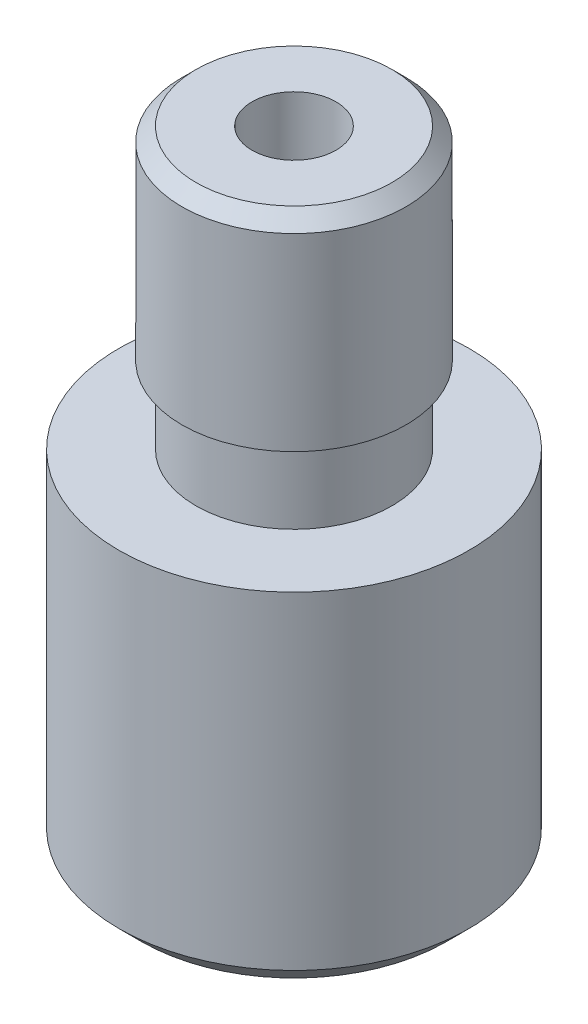
ISO-10303-21;
HEADER;
FILE_DESCRIPTION(('STEP AP214'),'2;1');
FILE_NAME('part.step','',(''),(''),'','','');
FILE_SCHEMA(('AUTOMOTIVE_DESIGN { 1 0 10303 214 1 1 1 1 }'));
ENDSEC;
DATA;
#1=APPLICATION_CONTEXT('core data for automotive mechanical design processes');
#2=APPLICATION_PROTOCOL_DEFINITION('international standard','automotive_design',2000,#1);
#3=PRODUCT_CONTEXT('',#1,'mechanical');
#4=PRODUCT('Part','Part','',(#3));
#5=PRODUCT_RELATED_PRODUCT_CATEGORY('part','',(#4));
#6=PRODUCT_DEFINITION_FORMATION('','',#4);
#7=PRODUCT_DEFINITION_CONTEXT('part definition',#1,'design');
#8=PRODUCT_DEFINITION('design','',#6,#7);
#9=PRODUCT_DEFINITION_SHAPE('','',#8);
#10=(LENGTH_UNIT() NAMED_UNIT(*) SI_UNIT(.MILLI.,.METRE.));
#11=(NAMED_UNIT(*) PLANE_ANGLE_UNIT() SI_UNIT($,.RADIAN.));
#12=(NAMED_UNIT(*) SI_UNIT($,.STERADIAN.) SOLID_ANGLE_UNIT());
#13=UNCERTAINTY_MEASURE_WITH_UNIT(LENGTH_MEASURE(1.E-05),#10,'distance_accuracy_value','');
#14=(GEOMETRIC_REPRESENTATION_CONTEXT(3) GLOBAL_UNCERTAINTY_ASSIGNED_CONTEXT((#13)) GLOBAL_UNIT_ASSIGNED_CONTEXT((#10,
#11,#12)) REPRESENTATION_CONTEXT('',''));
#15=CARTESIAN_POINT('',(0.,0.,0.));
#16=DIRECTION('',(0.,0.,1.));
#17=DIRECTION('',(1.,0.,0.));
#18=AXIS2_PLACEMENT_3D('',#15,#16,#17);
#19=CARTESIAN_POINT('',(0.,36.6101694915254,0.));
#20=DIRECTION('',(0.,1.,0.));
#21=DIRECTION('',(0.,0.,1.));
#22=AXIS2_PLACEMENT_3D('',#19,#20,#21);
#23=CYLINDRICAL_SURFACE('',#22,12.5);
#24=CARTESIAN_POINT('',(0.,-28.9084745762712,0.));
#25=DIRECTION('',(0.,1.,0.));
#26=DIRECTION('',(0.,0.,1.));
#27=AXIS2_PLACEMENT_3D('',#24,#25,#26);
#28=CIRCLE('',#27,12.5);
#29=CARTESIAN_POINT('',(0.,-28.9084745762712,12.5));
#30=VERTEX_POINT('',#29);
#31=EDGE_CURVE('E51',#30,#30,#28,.T.);
#32=ORIENTED_EDGE('',*,*,#31,.T.);
#33=EDGE_LOOP('',(#32));
#34=FACE_BOUND('',#33,.T.);
#35=CARTESIAN_POINT('',(0.,-5.50847457627119,0.));
#36=DIRECTION('',(0.,1.,0.));
#37=DIRECTION('',(0.,0.,1.));
#38=AXIS2_PLACEMENT_3D('',#35,#36,#37);
#39=CIRCLE('',#38,12.5);
#40=CARTESIAN_POINT('',(0.,-5.50847457627119,12.5));
#41=VERTEX_POINT('',#40);
#42=EDGE_CURVE('E56',#41,#41,#39,.T.);
#43=ORIENTED_EDGE('',*,*,#42,.F.);
#44=EDGE_LOOP('',(#43));
#45=FACE_BOUND('',#44,.T.);
#46=ADVANCED_FACE('F35',(#34,#45),#23,.T.);
#47=CARTESIAN_POINT('',(12.5,-5.50847457627119,0.));
#48=DIRECTION('',(0.,-1.,0.));
#49=DIRECTION('',(0.,0.,-1.));
#50=AXIS2_PLACEMENT_3D('',#47,#48,#49);
#51=PLANE('',#50);
#52=CARTESIAN_POINT('',(0.,-5.50847457627119,0.));
#53=DIRECTION('',(0.,1.,0.));
#54=DIRECTION('',(0.,0.,1.));
#55=AXIS2_PLACEMENT_3D('',#52,#53,#54);
#56=CIRCLE('',#55,7.);
#57=CARTESIAN_POINT('',(0.,-5.50847457627119,7.));
#58=VERTEX_POINT('',#57);
#59=EDGE_CURVE('E59',#58,#58,#56,.T.);
#60=ORIENTED_EDGE('',*,*,#59,.F.);
#61=EDGE_LOOP('',(#60));
#62=FACE_BOUND('',#61,.T.);
#63=ORIENTED_EDGE('',*,*,#42,.T.);
#64=EDGE_LOOP('',(#63));
#65=FACE_BOUND('',#64,.T.);
#66=ADVANCED_FACE('F93',(#62,#65),#51,.F.);
#67=CARTESIAN_POINT('',(0.,36.6101694915254,0.));
#68=DIRECTION('',(0.,1.,0.));
#69=DIRECTION('',(0.,0.,1.));
#70=AXIS2_PLACEMENT_3D('',#67,#68,#69);
#71=CYLINDRICAL_SURFACE('',#70,7.);
#72=CARTESIAN_POINT('',(0.,0.,0.));
#73=DIRECTION('',(0.,1.,0.));
#74=DIRECTION('',(0.,0.,1.));
#75=AXIS2_PLACEMENT_3D('',#72,#73,#74);
#76=CIRCLE('',#75,7.00000000000001);
#77=CARTESIAN_POINT('',(0.,0.,7.00000000000001));
#78=VERTEX_POINT('',#77);
#79=EDGE_CURVE('E62',#78,#78,#76,.T.);
#80=ORIENTED_EDGE('',*,*,#79,.F.);
#81=EDGE_LOOP('',(#80));
#82=FACE_BOUND('',#81,.T.);
#83=ORIENTED_EDGE('',*,*,#59,.T.);
#84=EDGE_LOOP('',(#83));
#85=FACE_BOUND('',#84,.T.);
#86=ADVANCED_FACE('F99',(#82,#85),#71,.T.);
#87=CARTESIAN_POINT('',(7.00000000000001,0.,0.));
#88=DIRECTION('',(0.,1.,0.));
#89=DIRECTION('',(0.,0.,1.));
#90=AXIS2_PLACEMENT_3D('',#87,#88,#89);
#91=PLANE('',#90);
#92=CARTESIAN_POINT('',(0.,0.,0.));
#93=DIRECTION('',(0.,1.,0.));
#94=DIRECTION('',(0.,0.,1.));
#95=AXIS2_PLACEMENT_3D('',#92,#93,#94);
#96=CIRCLE('',#95,8.);
#97=CARTESIAN_POINT('',(0.,0.,8.));
#98=VERTEX_POINT('',#97);
#99=EDGE_CURVE('E65',#98,#98,#96,.T.);
#100=ORIENTED_EDGE('',*,*,#99,.F.);
#101=EDGE_LOOP('',(#100));
#102=FACE_BOUND('',#101,.T.);
#103=ORIENTED_EDGE('',*,*,#79,.T.);
#104=EDGE_LOOP('',(#103));
#105=FACE_BOUND('',#104,.T.);
#106=ADVANCED_FACE('F90',(#102,#105),#91,.F.);
#107=CARTESIAN_POINT('',(0.,36.6101694915254,0.));
#108=DIRECTION('',(0.,1.,0.));
#109=DIRECTION('',(0.,0.,1.));
#110=AXIS2_PLACEMENT_3D('',#107,#108,#109);
#111=CYLINDRICAL_SURFACE('',#110,8.);
#112=CARTESIAN_POINT('',(0.,13.4915254237288,0.));
#113=DIRECTION('',(0.,-1.,0.));
#114=DIRECTION('',(0.,0.,-1.));
#115=AXIS2_PLACEMENT_3D('',#112,#113,#114);
#116=CIRCLE('',#115,8.);
#117=CARTESIAN_POINT('',(0.,13.4915254237288,-8.));
#118=VERTEX_POINT('',#117);
#119=EDGE_CURVE('E10',#118,#118,#116,.T.);
#120=ORIENTED_EDGE('',*,*,#119,.T.);
#121=EDGE_LOOP('',(#120));
#122=FACE_BOUND('',#121,.T.);
#123=ORIENTED_EDGE('',*,*,#99,.T.);
#124=EDGE_LOOP('',(#123));
#125=FACE_BOUND('',#124,.T.);
#126=ADVANCED_FACE('F85',(#122,#125),#111,.T.);
#127=CARTESIAN_POINT('',(8.,14.4915254237288,0.));
#128=DIRECTION('',(0.,-1.,0.));
#129=DIRECTION('',(0.,0.,-1.));
#130=AXIS2_PLACEMENT_3D('',#127,#128,#129);
#131=PLANE('',#130);
#132=CARTESIAN_POINT('',(0.,14.4915254237288,0.));
#133=DIRECTION('',(0.,-1.,0.));
#134=DIRECTION('',(0.,0.,-1.));
#135=AXIS2_PLACEMENT_3D('',#132,#133,#134);
#136=CIRCLE('',#135,7.00000000000001);
#137=CARTESIAN_POINT('',(0.,14.4915254237288,-7.00000000000001));
#138=VERTEX_POINT('',#137);
#139=EDGE_CURVE('E43',#138,#138,#136,.F.);
#140=ORIENTED_EDGE('',*,*,#139,.T.);
#141=EDGE_LOOP('',(#140));
#142=FACE_BOUND('',#141,.T.);
#143=CARTESIAN_POINT('',(0.,14.4915254237288,0.));
#144=DIRECTION('',(0.,1.,0.));
#145=DIRECTION('',(0.,0.,1.));
#146=AXIS2_PLACEMENT_3D('',#143,#144,#145);
#147=CIRCLE('',#146,3.);
#148=CARTESIAN_POINT('',(0.,14.4915254237288,3.));
#149=VERTEX_POINT('',#148);
#150=EDGE_CURVE('E68',#149,#149,#147,.T.);
#151=ORIENTED_EDGE('',*,*,#150,.F.);
#152=EDGE_LOOP('',(#151));
#153=FACE_BOUND('',#152,.T.);
#154=ADVANCED_FACE('F80',(#142,#153),#131,.F.);
#155=CARTESIAN_POINT('',(0.,36.6101694915254,0.));
#156=DIRECTION('',(0.,1.,0.));
#157=DIRECTION('',(0.,0.,1.));
#158=AXIS2_PLACEMENT_3D('',#155,#156,#157);
#159=CYLINDRICAL_SURFACE('',#158,3.00000000000001);
#160=CARTESIAN_POINT('',(0.,-30.5084745762712,0.));
#161=DIRECTION('',(0.,1.,0.));
#162=DIRECTION('',(0.,0.,1.));
#163=AXIS2_PLACEMENT_3D('',#160,#161,#162);
#164=CIRCLE('',#163,3.00000000000001);
#165=CARTESIAN_POINT('',(0.,-30.5084745762712,3.00000000000001));
#166=VERTEX_POINT('',#165);
#167=EDGE_CURVE('E71',#166,#166,#164,.T.);
#168=ORIENTED_EDGE('',*,*,#167,.F.);
#169=EDGE_LOOP('',(#168));
#170=FACE_BOUND('',#169,.T.);
#171=ORIENTED_EDGE('',*,*,#150,.T.);
#172=EDGE_LOOP('',(#171));
#173=FACE_BOUND('',#172,.T.);
#174=ADVANCED_FACE('F77',(#170,#173),#159,.F.);
#175=CARTESIAN_POINT('',(3.00000000000001,-30.5084745762712,0.));
#176=DIRECTION('',(0.,1.,0.));
#177=DIRECTION('',(0.,0.,1.));
#178=AXIS2_PLACEMENT_3D('',#175,#176,#177);
#179=PLANE('',#178);
#180=CARTESIAN_POINT('',(0.,-30.5084745762712,0.));
#181=DIRECTION('',(0.,1.,0.));
#182=DIRECTION('',(0.,0.,1.));
#183=AXIS2_PLACEMENT_3D('',#180,#181,#182);
#184=CIRCLE('',#183,10.9);
#185=CARTESIAN_POINT('',(0.,-30.5084745762712,10.9));
#186=VERTEX_POINT('',#185);
#187=EDGE_CURVE('E47',#186,#186,#184,.F.);
#188=ORIENTED_EDGE('',*,*,#187,.T.);
#189=EDGE_LOOP('',(#188));
#190=FACE_BOUND('',#189,.T.);
#191=ORIENTED_EDGE('',*,*,#167,.T.);
#192=EDGE_LOOP('',(#191));
#193=FACE_BOUND('',#192,.T.);
#194=ADVANCED_FACE('F75',(#190,#193),#179,.F.);
#195=CARTESIAN_POINT('',(0.,-28.9084745762712,0.));
#196=DIRECTION('',(0.,1.,0.));
#197=DIRECTION('',(0.,0.,1.));
#198=AXIS2_PLACEMENT_3D('',#195,#196,#197);
#199=CONICAL_SURFACE('',#198,12.5,0.785398163397457);
#200=ORIENTED_EDGE('',*,*,#187,.F.);
#201=EDGE_LOOP('',(#200));
#202=FACE_BOUND('',#201,.T.);
#203=ORIENTED_EDGE('',*,*,#31,.F.);
#204=EDGE_LOOP('',(#203));
#205=FACE_BOUND('',#204,.T.);
#206=ADVANCED_FACE('F105',(#202,#205),#199,.T.);
#207=CARTESIAN_POINT('',(0.,14.4915254237288,0.));
#208=DIRECTION('',(0.,-1.,0.));
#209=DIRECTION('',(0.,0.,-1.));
#210=AXIS2_PLACEMENT_3D('',#207,#208,#209);
#211=CONICAL_SURFACE('',#210,7.00000000000001,0.785398163397448);
#212=ORIENTED_EDGE('',*,*,#119,.F.);
#213=EDGE_LOOP('',(#212));
#214=FACE_BOUND('',#213,.T.);
#215=ORIENTED_EDGE('',*,*,#139,.F.);
#216=EDGE_LOOP('',(#215));
#217=FACE_BOUND('',#216,.T.);
#218=ADVANCED_FACE('F38',(#214,#217),#211,.T.);
#219=CLOSED_SHELL('',(#46,#66,#86,#106,#126,#154,#174,#194,#206,#218));
#220=MANIFOLD_SOLID_BREP('B2',#219);
#221=ADVANCED_BREP_SHAPE_REPRESENTATION('',(#18,#220),#14);
#222=SHAPE_DEFINITION_REPRESENTATION(#9,#221);
ENDSEC;
END-ISO-10303-21;
